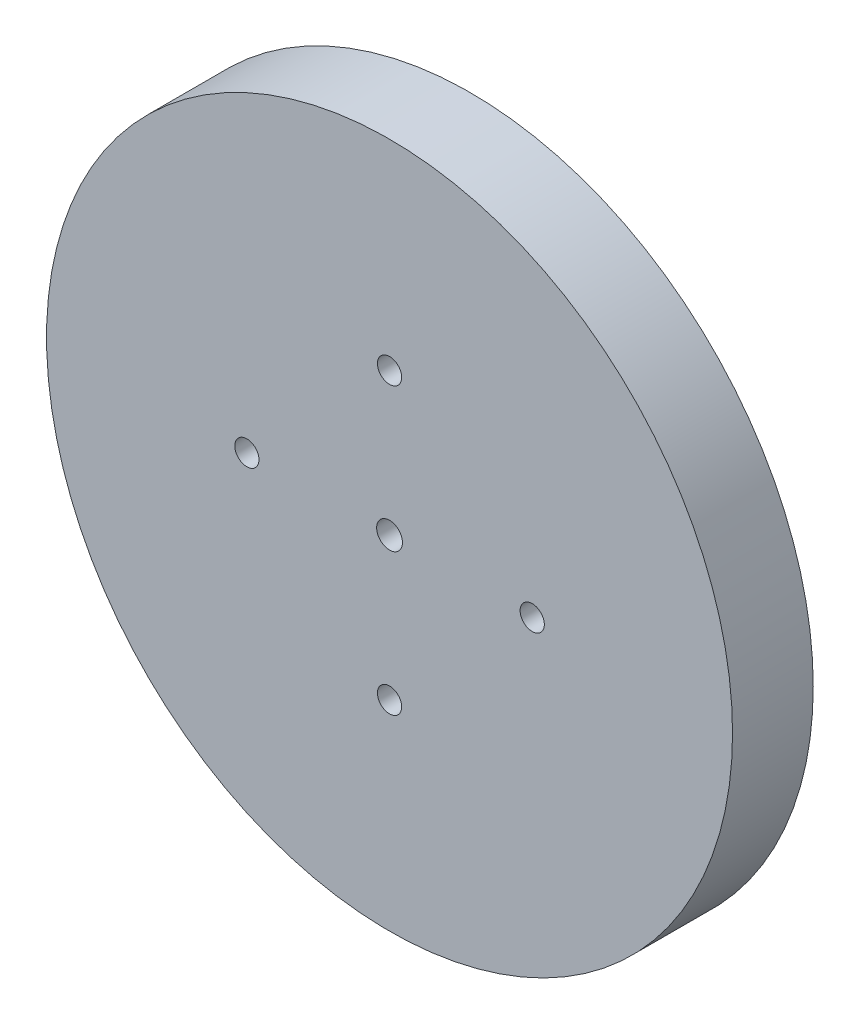
ISO-10303-21;
HEADER;
FILE_DESCRIPTION(('STEP AP214'),'2;1');
FILE_NAME('part.step','',(''),(''),'','','');
FILE_SCHEMA(('AUTOMOTIVE_DESIGN { 1 0 10303 214 1 1 1 1 }'));
ENDSEC;
DATA;
#1=APPLICATION_CONTEXT('core data for automotive mechanical design processes');
#2=APPLICATION_PROTOCOL_DEFINITION('international standard','automotive_design',2000,#1);
#3=PRODUCT_CONTEXT('',#1,'mechanical');
#4=PRODUCT('Part','Part','',(#3));
#5=PRODUCT_RELATED_PRODUCT_CATEGORY('part','',(#4));
#6=PRODUCT_DEFINITION_FORMATION('','',#4);
#7=PRODUCT_DEFINITION_CONTEXT('part definition',#1,'design');
#8=PRODUCT_DEFINITION('design','',#6,#7);
#9=PRODUCT_DEFINITION_SHAPE('','',#8);
#10=(LENGTH_UNIT() NAMED_UNIT(*) SI_UNIT(.MILLI.,.METRE.));
#11=(NAMED_UNIT(*) PLANE_ANGLE_UNIT() SI_UNIT($,.RADIAN.));
#12=(NAMED_UNIT(*) SI_UNIT($,.STERADIAN.) SOLID_ANGLE_UNIT());
#13=UNCERTAINTY_MEASURE_WITH_UNIT(LENGTH_MEASURE(1.E-05),#10,'distance_accuracy_value','');
#14=(GEOMETRIC_REPRESENTATION_CONTEXT(3) GLOBAL_UNCERTAINTY_ASSIGNED_CONTEXT((#13)) GLOBAL_UNIT_ASSIGNED_CONTEXT((#10,
#11,#12)) REPRESENTATION_CONTEXT('',''));
#15=CARTESIAN_POINT('',(0.,0.,0.));
#16=DIRECTION('',(0.,0.,1.));
#17=DIRECTION('',(1.,0.,0.));
#18=AXIS2_PLACEMENT_3D('',#15,#16,#17);
#19=CARTESIAN_POINT('',(0.,0.,0.));
#20=DIRECTION('',(0.,0.,1.));
#21=DIRECTION('',(1.,0.,0.));
#22=AXIS2_PLACEMENT_3D('',#19,#20,#21);
#23=PLANE('',#22);
#24=CARTESIAN_POINT('',(0.,0.,0.));
#25=DIRECTION('',(0.,0.,1.));
#26=DIRECTION('',(1.,0.,0.));
#27=AXIS2_PLACEMENT_3D('',#24,#25,#26);
#28=CIRCLE('',#27,42.5);
#29=CARTESIAN_POINT('',(42.5,0.,0.));
#30=VERTEX_POINT('',#29);
#31=EDGE_CURVE('E44',#30,#30,#28,.T.);
#32=ORIENTED_EDGE('',*,*,#31,.F.);
#33=EDGE_LOOP('',(#32));
#34=FACE_BOUND('',#33,.T.);
#35=CARTESIAN_POINT('',(0.,0.,0.));
#36=DIRECTION('',(0.,0.,-1.));
#37=DIRECTION('',(-1.,0.,0.));
#38=AXIS2_PLACEMENT_3D('',#35,#36,#37);
#39=CIRCLE('',#38,41.7272565712727);
#40=CARTESIAN_POINT('',(-41.7272565712727,0.,0.));
#41=VERTEX_POINT('',#40);
#42=EDGE_CURVE('E88',#41,#41,#39,.T.);
#43=ORIENTED_EDGE('',*,*,#42,.F.);
#44=EDGE_LOOP('',(#43));
#45=FACE_BOUND('',#44,.T.);
#46=ADVANCED_FACE('F36',(#34,#45),#23,.F.);
#47=CARTESIAN_POINT('',(0.,0.,0.));
#48=DIRECTION('',(0.,0.,-1.));
#49=DIRECTION('',(-1.,0.,0.));
#50=AXIS2_PLACEMENT_3D('',#47,#48,#49);
#51=CIRCLE('',#50,39.5);
#52=CARTESIAN_POINT('',(-39.5,0.,0.));
#53=VERTEX_POINT('',#52);
#54=EDGE_CURVE('E52',#53,#53,#51,.T.);
#55=ORIENTED_EDGE('',*,*,#54,.F.);
#56=EDGE_LOOP('',(#55));
#57=FACE_BOUND('',#56,.T.);
#58=CARTESIAN_POINT('',(0.,0.,0.));
#59=DIRECTION('',(0.,0.,-1.));
#60=DIRECTION('',(-1.,0.,0.));
#61=AXIS2_PLACEMENT_3D('',#58,#59,#60);
#62=CIRCLE('',#61,40.2727434287273);
#63=CARTESIAN_POINT('',(-40.2727434287273,0.,0.));
#64=VERTEX_POINT('',#63);
#65=EDGE_CURVE('E95',#64,#64,#62,.T.);
#66=ORIENTED_EDGE('',*,*,#65,.T.);
#67=EDGE_LOOP('',(#66));
#68=FACE_BOUND('',#67,.T.);
#69=ADVANCED_FACE('F99',(#57,#68),#23,.F.);
#70=CARTESIAN_POINT('',(0.,0.,10.));
#71=DIRECTION('',(0.,0.,-1.));
#72=DIRECTION('',(-1.,0.,0.));
#73=AXIS2_PLACEMENT_3D('',#70,#71,#72);
#74=CYLINDRICAL_SURFACE('',#73,42.5);
#75=CARTESIAN_POINT('',(0.,0.,10.));
#76=DIRECTION('',(0.,0.,1.));
#77=DIRECTION('',(1.,0.,0.));
#78=AXIS2_PLACEMENT_3D('',#75,#76,#77);
#79=CIRCLE('',#78,42.5);
#80=CARTESIAN_POINT('',(42.5,0.,10.));
#81=VERTEX_POINT('',#80);
#82=EDGE_CURVE('E10',#81,#81,#79,.T.);
#83=ORIENTED_EDGE('',*,*,#82,.F.);
#84=EDGE_LOOP('',(#83));
#85=FACE_BOUND('',#84,.T.);
#86=ORIENTED_EDGE('',*,*,#31,.T.);
#87=EDGE_LOOP('',(#86));
#88=FACE_BOUND('',#87,.T.);
#89=ADVANCED_FACE('F38',(#85,#88),#74,.T.);
#90=CARTESIAN_POINT('',(0.,0.,10.));
#91=DIRECTION('',(0.,0.,1.));
#92=DIRECTION('',(1.,0.,0.));
#93=AXIS2_PLACEMENT_3D('',#90,#91,#92);
#94=PLANE('',#93);
#95=CARTESIAN_POINT('',(0.,-17.6776695296638,10.));
#96=DIRECTION('',(0.,0.,1.));
#97=DIRECTION('',(1.,0.,0.));
#98=AXIS2_PLACEMENT_3D('',#95,#96,#97);
#99=CIRCLE('',#98,1.5);
#100=CARTESIAN_POINT('',(1.50000000000001,-17.6776695296638,10.));
#101=VERTEX_POINT('',#100);
#102=EDGE_CURVE('E59',#101,#101,#99,.T.);
#103=ORIENTED_EDGE('',*,*,#102,.F.);
#104=EDGE_LOOP('',(#103));
#105=FACE_BOUND('',#104,.T.);
#106=CARTESIAN_POINT('',(0.,0.,10.));
#107=DIRECTION('',(0.,0.,1.));
#108=DIRECTION('',(1.,0.,0.));
#109=AXIS2_PLACEMENT_3D('',#106,#107,#108);
#110=CIRCLE('',#109,1.6);
#111=CARTESIAN_POINT('',(1.6,0.,10.));
#112=VERTEX_POINT('',#111);
#113=EDGE_CURVE('E85',#112,#112,#110,.T.);
#114=ORIENTED_EDGE('',*,*,#113,.F.);
#115=EDGE_LOOP('',(#114));
#116=FACE_BOUND('',#115,.T.);
#117=CARTESIAN_POINT('',(-17.6776695296638,0.,10.));
#118=DIRECTION('',(0.,0.,1.));
#119=DIRECTION('',(1.,0.,0.));
#120=AXIS2_PLACEMENT_3D('',#117,#118,#119);
#121=CIRCLE('',#120,1.5);
#122=CARTESIAN_POINT('',(-16.1776695296638,0.,10.));
#123=VERTEX_POINT('',#122);
#124=EDGE_CURVE('E82',#123,#123,#121,.T.);
#125=ORIENTED_EDGE('',*,*,#124,.F.);
#126=EDGE_LOOP('',(#125));
#127=FACE_BOUND('',#126,.T.);
#128=CARTESIAN_POINT('',(0.,17.6776695296637,10.));
#129=DIRECTION('',(0.,0.,1.));
#130=DIRECTION('',(1.,0.,0.));
#131=AXIS2_PLACEMENT_3D('',#128,#129,#130);
#132=CIRCLE('',#131,1.5);
#133=CARTESIAN_POINT('',(1.50000000000001,17.6776695296637,10.));
#134=VERTEX_POINT('',#133);
#135=EDGE_CURVE('E78',#134,#134,#132,.T.);
#136=ORIENTED_EDGE('',*,*,#135,.F.);
#137=EDGE_LOOP('',(#136));
#138=FACE_BOUND('',#137,.T.);
#139=CARTESIAN_POINT('',(17.6776695296637,0.,10.));
#140=DIRECTION('',(0.,0.,1.));
#141=DIRECTION('',(1.,0.,0.));
#142=AXIS2_PLACEMENT_3D('',#139,#140,#141);
#143=CIRCLE('',#142,1.5);
#144=CARTESIAN_POINT('',(19.1776695296637,0.,10.));
#145=VERTEX_POINT('',#144);
#146=EDGE_CURVE('E81',#145,#145,#143,.T.);
#147=ORIENTED_EDGE('',*,*,#146,.F.);
#148=EDGE_LOOP('',(#147));
#149=FACE_BOUND('',#148,.T.);
#150=ORIENTED_EDGE('',*,*,#82,.T.);
#151=EDGE_LOOP('',(#150));
#152=FACE_BOUND('',#151,.T.);
#153=ADVANCED_FACE('F120',(#105,#116,#127,#138,#149,#152),#94,.T.);
#154=CARTESIAN_POINT('',(0.,0.,6.99999999999999));
#155=DIRECTION('',(0.,0.,-1.));
#156=DIRECTION('',(-1.,0.,0.));
#157=AXIS2_PLACEMENT_3D('',#154,#155,#156);
#158=CYLINDRICAL_SURFACE('',#157,39.5);
#159=CARTESIAN_POINT('',(0.,0.,6.99999999999999));
#160=DIRECTION('',(0.,0.,-1.));
#161=DIRECTION('',(-1.,0.,0.));
#162=AXIS2_PLACEMENT_3D('',#159,#160,#161);
#163=CIRCLE('',#162,39.5);
#164=CARTESIAN_POINT('',(-39.5,0.,6.99999999999999));
#165=VERTEX_POINT('',#164);
#166=EDGE_CURVE('E49',#165,#165,#163,.T.);
#167=ORIENTED_EDGE('',*,*,#166,.F.);
#168=EDGE_LOOP('',(#167));
#169=FACE_BOUND('',#168,.T.);
#170=ORIENTED_EDGE('',*,*,#54,.T.);
#171=EDGE_LOOP('',(#170));
#172=FACE_BOUND('',#171,.T.);
#173=ADVANCED_FACE('F123',(#169,#172),#158,.F.);
#174=CARTESIAN_POINT('',(0.,0.,6.99999999999999));
#175=DIRECTION('',(0.,0.,-1.));
#176=DIRECTION('',(-1.,0.,0.));
#177=AXIS2_PLACEMENT_3D('',#174,#175,#176);
#178=PLANE('',#177);
#179=CARTESIAN_POINT('',(0.,-17.6776695296638,6.99999999999999));
#180=DIRECTION('',(0.,0.,-1.));
#181=DIRECTION('',(-1.,0.,0.));
#182=AXIS2_PLACEMENT_3D('',#179,#180,#181);
#183=CIRCLE('',#182,1.5);
#184=CARTESIAN_POINT('',(-1.49999999999999,-17.6776695296638,6.99999999999999));
#185=VERTEX_POINT('',#184);
#186=EDGE_CURVE('E40',#185,#185,#183,.T.);
#187=ORIENTED_EDGE('',*,*,#186,.F.);
#188=EDGE_LOOP('',(#187));
#189=FACE_BOUND('',#188,.T.);
#190=CARTESIAN_POINT('',(0.,0.,6.99999999999999));
#191=DIRECTION('',(0.,0.,-1.));
#192=DIRECTION('',(-1.,0.,0.));
#193=AXIS2_PLACEMENT_3D('',#190,#191,#192);
#194=CIRCLE('',#193,1.6);
#195=CARTESIAN_POINT('',(-1.6,0.,6.99999999999999));
#196=VERTEX_POINT('',#195);
#197=EDGE_CURVE('E64',#196,#196,#194,.T.);
#198=ORIENTED_EDGE('',*,*,#197,.F.);
#199=EDGE_LOOP('',(#198));
#200=FACE_BOUND('',#199,.T.);
#201=CARTESIAN_POINT('',(-17.6776695296638,0.,6.99999999999999));
#202=DIRECTION('',(0.,0.,-1.));
#203=DIRECTION('',(-1.,0.,0.));
#204=AXIS2_PLACEMENT_3D('',#201,#202,#203);
#205=CIRCLE('',#204,1.5);
#206=CARTESIAN_POINT('',(-19.1776695296638,0.,6.99999999999999));
#207=VERTEX_POINT('',#206);
#208=EDGE_CURVE('E62',#207,#207,#205,.T.);
#209=ORIENTED_EDGE('',*,*,#208,.F.);
#210=EDGE_LOOP('',(#209));
#211=FACE_BOUND('',#210,.T.);
#212=CARTESIAN_POINT('',(0.,17.6776695296637,6.99999999999999));
#213=DIRECTION('',(0.,0.,-1.));
#214=DIRECTION('',(-1.,0.,0.));
#215=AXIS2_PLACEMENT_3D('',#212,#213,#214);
#216=CIRCLE('',#215,1.5);
#217=CARTESIAN_POINT('',(-1.5,17.6776695296637,6.99999999999999));
#218=VERTEX_POINT('',#217);
#219=EDGE_CURVE('E58',#218,#218,#216,.T.);
#220=ORIENTED_EDGE('',*,*,#219,.F.);
#221=EDGE_LOOP('',(#220));
#222=FACE_BOUND('',#221,.T.);
#223=CARTESIAN_POINT('',(17.6776695296637,0.,6.99999999999999));
#224=DIRECTION('',(0.,0.,-1.));
#225=DIRECTION('',(-1.,0.,0.));
#226=AXIS2_PLACEMENT_3D('',#223,#224,#225);
#227=CIRCLE('',#226,1.5);
#228=CARTESIAN_POINT('',(16.1776695296637,0.,6.99999999999999));
#229=VERTEX_POINT('',#228);
#230=EDGE_CURVE('E55',#229,#229,#227,.T.);
#231=ORIENTED_EDGE('',*,*,#230,.F.);
#232=EDGE_LOOP('',(#231));
#233=FACE_BOUND('',#232,.T.);
#234=ORIENTED_EDGE('',*,*,#166,.T.);
#235=EDGE_LOOP('',(#234));
#236=FACE_BOUND('',#235,.T.);
#237=ADVANCED_FACE('F127',(#189,#200,#211,#222,#233,#236),#178,.T.);
#238=CARTESIAN_POINT('',(17.6776695296637,0.,0.));
#239=DIRECTION('',(0.,0.,1.));
#240=DIRECTION('',(1.,0.,0.));
#241=AXIS2_PLACEMENT_3D('',#238,#239,#240);
#242=CYLINDRICAL_SURFACE('',#241,1.5);
#243=ORIENTED_EDGE('',*,*,#230,.T.);
#244=EDGE_LOOP('',(#243));
#245=FACE_BOUND('',#244,.T.);
#246=ORIENTED_EDGE('',*,*,#146,.T.);
#247=EDGE_LOOP('',(#246));
#248=FACE_BOUND('',#247,.T.);
#249=ADVANCED_FACE('F131',(#245,#248),#242,.F.);
#250=CARTESIAN_POINT('',(0.,17.6776695296637,0.));
#251=DIRECTION('',(0.,0.,1.));
#252=DIRECTION('',(1.,0.,0.));
#253=AXIS2_PLACEMENT_3D('',#250,#251,#252);
#254=CYLINDRICAL_SURFACE('',#253,1.5);
#255=ORIENTED_EDGE('',*,*,#219,.T.);
#256=EDGE_LOOP('',(#255));
#257=FACE_BOUND('',#256,.T.);
#258=ORIENTED_EDGE('',*,*,#135,.T.);
#259=EDGE_LOOP('',(#258));
#260=FACE_BOUND('',#259,.T.);
#261=ADVANCED_FACE('F133',(#257,#260),#254,.F.);
#262=CARTESIAN_POINT('',(-17.6776695296638,0.,0.));
#263=DIRECTION('',(0.,0.,1.));
#264=DIRECTION('',(1.,0.,0.));
#265=AXIS2_PLACEMENT_3D('',#262,#263,#264);
#266=CYLINDRICAL_SURFACE('',#265,1.5);
#267=ORIENTED_EDGE('',*,*,#208,.T.);
#268=EDGE_LOOP('',(#267));
#269=FACE_BOUND('',#268,.T.);
#270=ORIENTED_EDGE('',*,*,#124,.T.);
#271=EDGE_LOOP('',(#270));
#272=FACE_BOUND('',#271,.T.);
#273=ADVANCED_FACE('F136',(#269,#272),#266,.F.);
#274=CARTESIAN_POINT('',(0.,0.,0.));
#275=DIRECTION('',(0.,0.,1.));
#276=DIRECTION('',(1.,0.,0.));
#277=AXIS2_PLACEMENT_3D('',#274,#275,#276);
#278=CYLINDRICAL_SURFACE('',#277,1.6);
#279=ORIENTED_EDGE('',*,*,#197,.T.);
#280=EDGE_LOOP('',(#279));
#281=FACE_BOUND('',#280,.T.);
#282=ORIENTED_EDGE('',*,*,#113,.T.);
#283=EDGE_LOOP('',(#282));
#284=FACE_BOUND('',#283,.T.);
#285=ADVANCED_FACE('F109',(#281,#284),#278,.F.);
#286=CARTESIAN_POINT('',(0.,-17.6776695296638,0.));
#287=DIRECTION('',(0.,0.,1.));
#288=DIRECTION('',(1.,0.,0.));
#289=AXIS2_PLACEMENT_3D('',#286,#287,#288);
#290=CYLINDRICAL_SURFACE('',#289,1.5);
#291=ORIENTED_EDGE('',*,*,#186,.T.);
#292=EDGE_LOOP('',(#291));
#293=FACE_BOUND('',#292,.T.);
#294=ORIENTED_EDGE('',*,*,#102,.T.);
#295=EDGE_LOOP('',(#294));
#296=FACE_BOUND('',#295,.T.);
#297=ADVANCED_FACE('F103',(#293,#296),#290,.F.);
#298=CARTESIAN_POINT('',(0.,0.,-0.333313485386794));
#299=DIRECTION('',(0.,0.,-1.));
#300=DIRECTION('',(-1.,0.,0.));
#301=AXIS2_PLACEMENT_3D('',#298,#299,#300);
#302=TOROIDAL_SURFACE('',#301,41.,0.800000000000002);
#303=ORIENTED_EDGE('',*,*,#42,.T.);
#304=EDGE_LOOP('',(#303));
#305=FACE_BOUND('',#304,.T.);
#306=ORIENTED_EDGE('',*,*,#65,.F.);
#307=EDGE_LOOP('',(#306));
#308=FACE_BOUND('',#307,.T.);
#309=ADVANCED_FACE('F101',(#305,#308),#302,.F.);
#310=CLOSED_SHELL('',(#46,#69,#89,#153,#173,#237,#249,#261,#273,#285,#297,#309));
#311=MANIFOLD_SOLID_BREP('B2',#310);
#312=ADVANCED_BREP_SHAPE_REPRESENTATION('',(#18,#311),#14);
#313=SHAPE_DEFINITION_REPRESENTATION(#9,#312);
ENDSEC;
END-ISO-10303-21;
